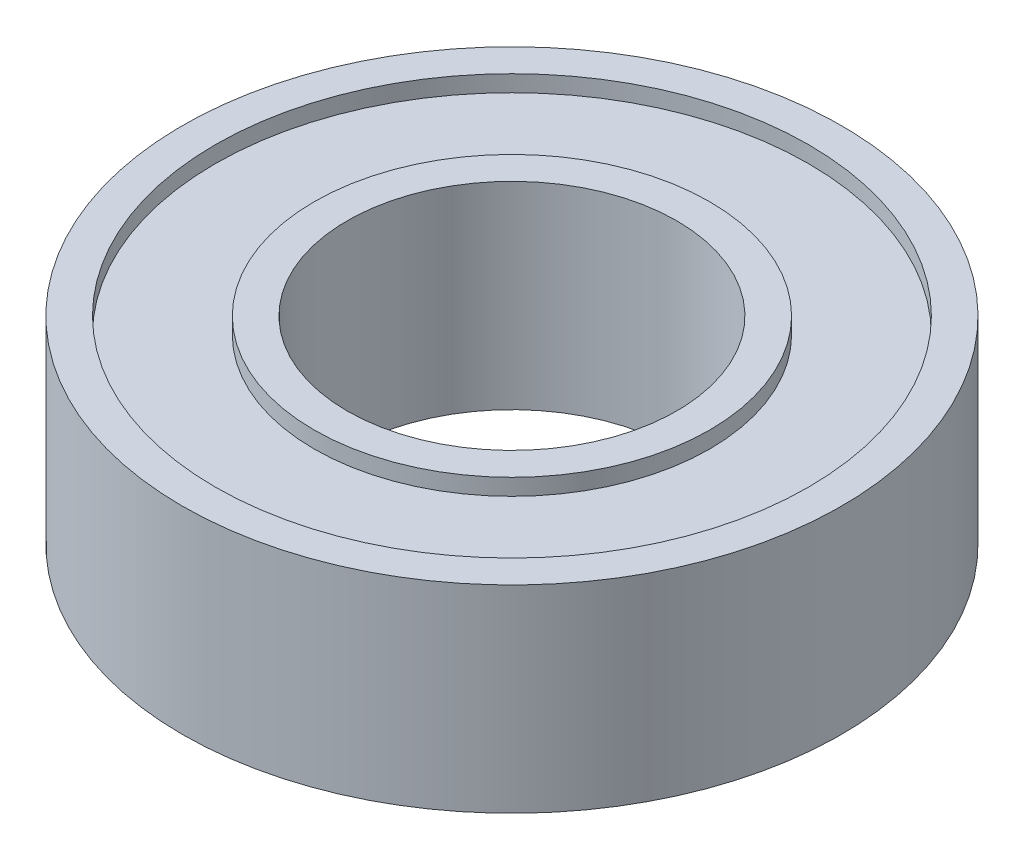
ISO-10303-21;
HEADER;
FILE_DESCRIPTION(('STEP AP214'),'2;1');
FILE_NAME('part.step','',(''),(''),'','','');
FILE_SCHEMA(('AUTOMOTIVE_DESIGN { 1 0 10303 214 1 1 1 1 }'));
ENDSEC;
DATA;
#1=APPLICATION_CONTEXT('core data for automotive mechanical design processes');
#2=APPLICATION_PROTOCOL_DEFINITION('international standard','automotive_design',2000,#1);
#3=PRODUCT_CONTEXT('',#1,'mechanical');
#4=PRODUCT('Part','Part','',(#3));
#5=PRODUCT_RELATED_PRODUCT_CATEGORY('part','',(#4));
#6=PRODUCT_DEFINITION_FORMATION('','',#4);
#7=PRODUCT_DEFINITION_CONTEXT('part definition',#1,'design');
#8=PRODUCT_DEFINITION('design','',#6,#7);
#9=PRODUCT_DEFINITION_SHAPE('','',#8);
#10=(LENGTH_UNIT() NAMED_UNIT(*) SI_UNIT(.MILLI.,.METRE.));
#11=(NAMED_UNIT(*) PLANE_ANGLE_UNIT() SI_UNIT($,.RADIAN.));
#12=(NAMED_UNIT(*) SI_UNIT($,.STERADIAN.) SOLID_ANGLE_UNIT());
#13=UNCERTAINTY_MEASURE_WITH_UNIT(LENGTH_MEASURE(1.E-05),#10,'distance_accuracy_value','');
#14=(GEOMETRIC_REPRESENTATION_CONTEXT(3) GLOBAL_UNCERTAINTY_ASSIGNED_CONTEXT((#13)) GLOBAL_UNIT_ASSIGNED_CONTEXT((#10,
#11,#12)) REPRESENTATION_CONTEXT('',''));
#15=CARTESIAN_POINT('',(0.,0.,0.));
#16=DIRECTION('',(0.,0.,1.));
#17=DIRECTION('',(1.,0.,0.));
#18=AXIS2_PLACEMENT_3D('',#15,#16,#17);
#19=CARTESIAN_POINT('',(0.,3.,0.));
#20=DIRECTION('',(0.,1.,0.));
#21=DIRECTION('',(0.,0.,1.));
#22=AXIS2_PLACEMENT_3D('',#19,#20,#21);
#23=PLANE('',#22);
#24=CARTESIAN_POINT('',(0.,3.,0.));
#25=DIRECTION('',(0.,1.,0.));
#26=DIRECTION('',(0.,0.,1.));
#27=AXIS2_PLACEMENT_3D('',#24,#25,#26);
#28=CIRCLE('',#27,2.5);
#29=CARTESIAN_POINT('',(0.,3.,2.5));
#30=VERTEX_POINT('',#29);
#31=EDGE_CURVE('E44',#30,#30,#28,.T.);
#32=ORIENTED_EDGE('',*,*,#31,.F.);
#33=EDGE_LOOP('',(#32));
#34=FACE_BOUND('',#33,.T.);
#35=CARTESIAN_POINT('',(0.,3.,0.));
#36=DIRECTION('',(0.,1.,0.));
#37=DIRECTION('',(0.,0.,1.));
#38=AXIS2_PLACEMENT_3D('',#35,#36,#37);
#39=CIRCLE('',#38,3.);
#40=CARTESIAN_POINT('',(0.,3.,3.));
#41=VERTEX_POINT('',#40);
#42=EDGE_CURVE('E70',#41,#41,#39,.T.);
#43=ORIENTED_EDGE('',*,*,#42,.T.);
#44=EDGE_LOOP('',(#43));
#45=FACE_BOUND('',#44,.T.);
#46=ADVANCED_FACE('F33',(#34,#45),#23,.T.);
#47=CARTESIAN_POINT('',(0.,0.,0.));
#48=DIRECTION('',(0.,1.,0.));
#49=DIRECTION('',(0.,0.,1.));
#50=AXIS2_PLACEMENT_3D('',#47,#48,#49);
#51=PLANE('',#50);
#52=CARTESIAN_POINT('',(0.,0.,0.));
#53=DIRECTION('',(0.,1.,0.));
#54=DIRECTION('',(0.,0.,1.));
#55=AXIS2_PLACEMENT_3D('',#52,#53,#54);
#56=CIRCLE('',#55,2.5);
#57=CARTESIAN_POINT('',(0.,0.,2.5));
#58=VERTEX_POINT('',#57);
#59=EDGE_CURVE('E46',#58,#58,#56,.T.);
#60=ORIENTED_EDGE('',*,*,#59,.T.);
#61=EDGE_LOOP('',(#60));
#62=FACE_BOUND('',#61,.T.);
#63=CARTESIAN_POINT('',(0.,0.,0.));
#64=DIRECTION('',(0.,-1.,0.));
#65=DIRECTION('',(0.,0.,-1.));
#66=AXIS2_PLACEMENT_3D('',#63,#64,#65);
#67=CIRCLE('',#66,3.);
#68=CARTESIAN_POINT('',(0.,0.,-3.));
#69=VERTEX_POINT('',#68);
#70=EDGE_CURVE('E58',#69,#69,#67,.T.);
#71=ORIENTED_EDGE('',*,*,#70,.T.);
#72=EDGE_LOOP('',(#71));
#73=FACE_BOUND('',#72,.T.);
#74=ADVANCED_FACE('F95',(#62,#73),#51,.F.);
#75=CARTESIAN_POINT('',(0.,3.,0.));
#76=DIRECTION('',(0.,1.,0.));
#77=DIRECTION('',(0.,0.,1.));
#78=AXIS2_PLACEMENT_3D('',#75,#76,#77);
#79=CIRCLE('',#78,4.5);
#80=CARTESIAN_POINT('',(0.,3.,4.5));
#81=VERTEX_POINT('',#80);
#82=EDGE_CURVE('E64',#81,#81,#79,.T.);
#83=ORIENTED_EDGE('',*,*,#82,.F.);
#84=EDGE_LOOP('',(#83));
#85=FACE_BOUND('',#84,.T.);
#86=CARTESIAN_POINT('',(0.,3.,0.));
#87=DIRECTION('',(0.,1.,0.));
#88=DIRECTION('',(0.,0.,1.));
#89=AXIS2_PLACEMENT_3D('',#86,#87,#88);
#90=CIRCLE('',#89,5.);
#91=CARTESIAN_POINT('',(0.,3.,5.));
#92=VERTEX_POINT('',#91);
#93=EDGE_CURVE('E10',#92,#92,#90,.T.);
#94=ORIENTED_EDGE('',*,*,#93,.T.);
#95=EDGE_LOOP('',(#94));
#96=FACE_BOUND('',#95,.T.);
#97=ADVANCED_FACE('F92',(#85,#96),#23,.T.);
#98=CARTESIAN_POINT('',(0.,0.,0.));
#99=DIRECTION('',(0.,-1.,0.));
#100=DIRECTION('',(0.,0.,-1.));
#101=AXIS2_PLACEMENT_3D('',#98,#99,#100);
#102=CIRCLE('',#101,4.5);
#103=CARTESIAN_POINT('',(0.,0.,-4.5));
#104=VERTEX_POINT('',#103);
#105=EDGE_CURVE('E52',#104,#104,#102,.T.);
#106=ORIENTED_EDGE('',*,*,#105,.F.);
#107=EDGE_LOOP('',(#106));
#108=FACE_BOUND('',#107,.T.);
#109=CARTESIAN_POINT('',(0.,0.,0.));
#110=DIRECTION('',(0.,1.,0.));
#111=DIRECTION('',(0.,0.,1.));
#112=AXIS2_PLACEMENT_3D('',#109,#110,#111);
#113=CIRCLE('',#112,5.);
#114=CARTESIAN_POINT('',(0.,0.,5.));
#115=VERTEX_POINT('',#114);
#116=EDGE_CURVE('E37',#115,#115,#113,.T.);
#117=ORIENTED_EDGE('',*,*,#116,.F.);
#118=EDGE_LOOP('',(#117));
#119=FACE_BOUND('',#118,.T.);
#120=ADVANCED_FACE('F94',(#108,#119),#51,.F.);
#121=CARTESIAN_POINT('',(0.,3.,0.));
#122=DIRECTION('',(0.,-1.,0.));
#123=DIRECTION('',(0.,0.,-1.));
#124=AXIS2_PLACEMENT_3D('',#121,#122,#123);
#125=CYLINDRICAL_SURFACE('',#124,5.);
#126=ORIENTED_EDGE('',*,*,#93,.F.);
#127=EDGE_LOOP('',(#126));
#128=FACE_BOUND('',#127,.T.);
#129=ORIENTED_EDGE('',*,*,#116,.T.);
#130=EDGE_LOOP('',(#129));
#131=FACE_BOUND('',#130,.T.);
#132=ADVANCED_FACE('F35',(#128,#131),#125,.T.);
#133=CARTESIAN_POINT('',(0.,3.,0.));
#134=DIRECTION('',(0.,-1.,0.));
#135=DIRECTION('',(0.,0.,-1.));
#136=AXIS2_PLACEMENT_3D('',#133,#134,#135);
#137=CYLINDRICAL_SURFACE('',#136,2.5);
#138=ORIENTED_EDGE('',*,*,#31,.T.);
#139=EDGE_LOOP('',(#138));
#140=FACE_BOUND('',#139,.T.);
#141=ORIENTED_EDGE('',*,*,#59,.F.);
#142=EDGE_LOOP('',(#141));
#143=FACE_BOUND('',#142,.T.);
#144=ADVANCED_FACE('F125',(#140,#143),#137,.F.);
#145=CARTESIAN_POINT('',(0.,0.25,0.));
#146=DIRECTION('',(0.,-1.,0.));
#147=DIRECTION('',(0.,0.,-1.));
#148=AXIS2_PLACEMENT_3D('',#145,#146,#147);
#149=CYLINDRICAL_SURFACE('',#148,4.5);
#150=CARTESIAN_POINT('',(0.,0.25,0.));
#151=DIRECTION('',(0.,-1.,0.));
#152=DIRECTION('',(0.,0.,-1.));
#153=AXIS2_PLACEMENT_3D('',#150,#151,#152);
#154=CIRCLE('',#153,4.5);
#155=CARTESIAN_POINT('',(0.,0.25,-4.5));
#156=VERTEX_POINT('',#155);
#157=EDGE_CURVE('E49',#156,#156,#154,.T.);
#158=ORIENTED_EDGE('',*,*,#157,.F.);
#159=EDGE_LOOP('',(#158));
#160=FACE_BOUND('',#159,.T.);
#161=ORIENTED_EDGE('',*,*,#105,.T.);
#162=EDGE_LOOP('',(#161));
#163=FACE_BOUND('',#162,.T.);
#164=ADVANCED_FACE('F122',(#160,#163),#149,.F.);
#165=CARTESIAN_POINT('',(0.,0.25,0.));
#166=DIRECTION('',(0.,-1.,0.));
#167=DIRECTION('',(0.,0.,-1.));
#168=AXIS2_PLACEMENT_3D('',#165,#166,#167);
#169=PLANE('',#168);
#170=CARTESIAN_POINT('',(0.,0.25,0.));
#171=DIRECTION('',(0.,-1.,0.));
#172=DIRECTION('',(0.,0.,-1.));
#173=AXIS2_PLACEMENT_3D('',#170,#171,#172);
#174=CIRCLE('',#173,3.);
#175=CARTESIAN_POINT('',(0.,0.25,-3.));
#176=VERTEX_POINT('',#175);
#177=EDGE_CURVE('E55',#176,#176,#174,.T.);
#178=ORIENTED_EDGE('',*,*,#177,.F.);
#179=EDGE_LOOP('',(#178));
#180=FACE_BOUND('',#179,.T.);
#181=ORIENTED_EDGE('',*,*,#157,.T.);
#182=EDGE_LOOP('',(#181));
#183=FACE_BOUND('',#182,.T.);
#184=ADVANCED_FACE('F118',(#180,#183),#169,.T.);
#185=CARTESIAN_POINT('',(0.,0.25,0.));
#186=DIRECTION('',(0.,-1.,0.));
#187=DIRECTION('',(0.,0.,-1.));
#188=AXIS2_PLACEMENT_3D('',#185,#186,#187);
#189=CYLINDRICAL_SURFACE('',#188,3.);
#190=ORIENTED_EDGE('',*,*,#177,.T.);
#191=EDGE_LOOP('',(#190));
#192=FACE_BOUND('',#191,.T.);
#193=ORIENTED_EDGE('',*,*,#70,.F.);
#194=EDGE_LOOP('',(#193));
#195=FACE_BOUND('',#194,.T.);
#196=ADVANCED_FACE('F88',(#192,#195),#189,.T.);
#197=CARTESIAN_POINT('',(0.,2.75,0.));
#198=DIRECTION('',(0.,1.,0.));
#199=DIRECTION('',(0.,0.,1.));
#200=AXIS2_PLACEMENT_3D('',#197,#198,#199);
#201=CYLINDRICAL_SURFACE('',#200,4.5);
#202=CARTESIAN_POINT('',(0.,2.75,0.));
#203=DIRECTION('',(0.,1.,0.));
#204=DIRECTION('',(0.,0.,1.));
#205=AXIS2_PLACEMENT_3D('',#202,#203,#204);
#206=CIRCLE('',#205,4.5);
#207=CARTESIAN_POINT('',(0.,2.75,4.5));
#208=VERTEX_POINT('',#207);
#209=EDGE_CURVE('E61',#208,#208,#206,.T.);
#210=ORIENTED_EDGE('',*,*,#209,.F.);
#211=EDGE_LOOP('',(#210));
#212=FACE_BOUND('',#211,.T.);
#213=ORIENTED_EDGE('',*,*,#82,.T.);
#214=EDGE_LOOP('',(#213));
#215=FACE_BOUND('',#214,.T.);
#216=ADVANCED_FACE('F82',(#212,#215),#201,.F.);
#217=CARTESIAN_POINT('',(0.,2.75,0.));
#218=DIRECTION('',(0.,1.,0.));
#219=DIRECTION('',(0.,0.,1.));
#220=AXIS2_PLACEMENT_3D('',#217,#218,#219);
#221=PLANE('',#220);
#222=CARTESIAN_POINT('',(0.,2.75,0.));
#223=DIRECTION('',(0.,1.,0.));
#224=DIRECTION('',(0.,0.,1.));
#225=AXIS2_PLACEMENT_3D('',#222,#223,#224);
#226=CIRCLE('',#225,3.);
#227=CARTESIAN_POINT('',(0.,2.75,3.));
#228=VERTEX_POINT('',#227);
#229=EDGE_CURVE('E67',#228,#228,#226,.T.);
#230=ORIENTED_EDGE('',*,*,#229,.F.);
#231=EDGE_LOOP('',(#230));
#232=FACE_BOUND('',#231,.T.);
#233=ORIENTED_EDGE('',*,*,#209,.T.);
#234=EDGE_LOOP('',(#233));
#235=FACE_BOUND('',#234,.T.);
#236=ADVANCED_FACE('F79',(#232,#235),#221,.T.);
#237=CARTESIAN_POINT('',(0.,2.75,0.));
#238=DIRECTION('',(0.,1.,0.));
#239=DIRECTION('',(0.,0.,1.));
#240=AXIS2_PLACEMENT_3D('',#237,#238,#239);
#241=CYLINDRICAL_SURFACE('',#240,3.);
#242=ORIENTED_EDGE('',*,*,#229,.T.);
#243=EDGE_LOOP('',(#242));
#244=FACE_BOUND('',#243,.T.);
#245=ORIENTED_EDGE('',*,*,#42,.F.);
#246=EDGE_LOOP('',(#245));
#247=FACE_BOUND('',#246,.T.);
#248=ADVANCED_FACE('F76',(#244,#247),#241,.T.);
#249=CLOSED_SHELL('',(#46,#74,#97,#120,#132,#144,#164,#184,#196,#216,#236,#248));
#250=MANIFOLD_SOLID_BREP('B2',#249);
#251=ADVANCED_BREP_SHAPE_REPRESENTATION('',(#18,#250),#14);
#252=SHAPE_DEFINITION_REPRESENTATION(#9,#251);
ENDSEC;
END-ISO-10303-21;
